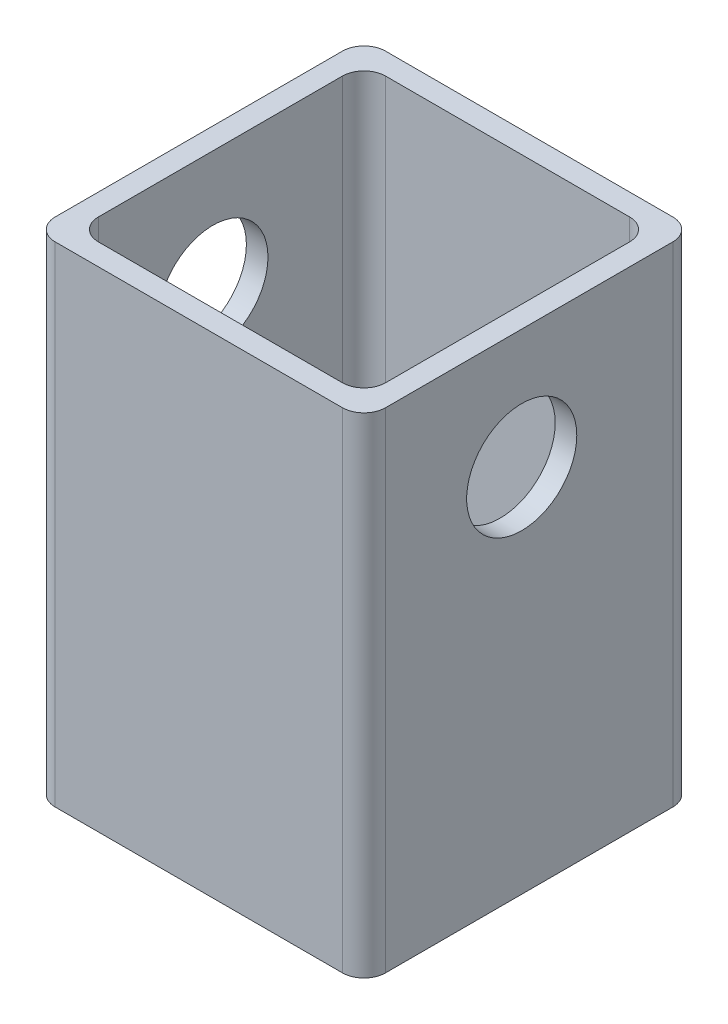
ISO-10303-21;
HEADER;
FILE_DESCRIPTION(('STEP AP214'),'2;1');
FILE_NAME('part.step','',(''),(''),'','','');
FILE_SCHEMA(('AUTOMOTIVE_DESIGN { 1 0 10303 214 1 1 1 1 }'));
ENDSEC;
DATA;
#1=APPLICATION_CONTEXT('core data for automotive mechanical design processes');
#2=APPLICATION_PROTOCOL_DEFINITION('international standard','automotive_design',2000,#1);
#3=PRODUCT_CONTEXT('',#1,'mechanical');
#4=PRODUCT('Part','Part','',(#3));
#5=PRODUCT_RELATED_PRODUCT_CATEGORY('part','',(#4));
#6=PRODUCT_DEFINITION_FORMATION('','',#4);
#7=PRODUCT_DEFINITION_CONTEXT('part definition',#1,'design');
#8=PRODUCT_DEFINITION('design','',#6,#7);
#9=PRODUCT_DEFINITION_SHAPE('','',#8);
#10=(LENGTH_UNIT() NAMED_UNIT(*) SI_UNIT(.MILLI.,.METRE.));
#11=(NAMED_UNIT(*) PLANE_ANGLE_UNIT() SI_UNIT($,.RADIAN.));
#12=(NAMED_UNIT(*) SI_UNIT($,.STERADIAN.) SOLID_ANGLE_UNIT());
#13=UNCERTAINTY_MEASURE_WITH_UNIT(LENGTH_MEASURE(1.E-05),#10,'distance_accuracy_value','');
#14=(GEOMETRIC_REPRESENTATION_CONTEXT(3) GLOBAL_UNCERTAINTY_ASSIGNED_CONTEXT((#13)) GLOBAL_UNIT_ASSIGNED_CONTEXT((#10,
#11,#12)) REPRESENTATION_CONTEXT('',''));
#15=CARTESIAN_POINT('',(0.,0.,0.));
#16=DIRECTION('',(0.,0.,1.));
#17=DIRECTION('',(1.,0.,0.));
#18=AXIS2_PLACEMENT_3D('',#15,#16,#17);
#19=CARTESIAN_POINT('',(7.0358,0.,-7.0358));
#20=DIRECTION('',(0.,1.,0.));
#21=DIRECTION('',(0.,0.,1.));
#22=AXIS2_PLACEMENT_3D('',#19,#20,#21);
#23=CYLINDRICAL_SURFACE('',#22,1.2446);
#24=CARTESIAN_POINT('',(7.0358,28.2217237840637,-7.0358));
#25=DIRECTION('',(0.,-1.,0.));
#26=DIRECTION('',(0.,0.,-1.));
#27=AXIS2_PLACEMENT_3D('',#24,#25,#26);
#28=CIRCLE('',#27,1.2446);
#29=CARTESIAN_POINT('',(7.03579999999999,28.2217237840637,-8.2804));
#30=VERTEX_POINT('',#29);
#31=CARTESIAN_POINT('',(8.2804,28.2217237840637,-7.03579999999999));
#32=VERTEX_POINT('',#31);
#33=EDGE_CURVE('E254',#30,#32,#28,.T.);
#34=ORIENTED_EDGE('',*,*,#33,.F.);
#35=DIRECTION('',(0.,1.,0.));
#36=VECTOR('',#35,1.);
#37=CARTESIAN_POINT('',(7.03579999999999,0.,-8.2804));
#38=LINE('',#37,#36);
#39=CARTESIAN_POINT('',(7.03579999999999,0.,-8.2804));
#40=VERTEX_POINT('',#39);
#41=EDGE_CURVE('E12',#40,#30,#38,.T.);
#42=ORIENTED_EDGE('',*,*,#41,.F.);
#43=CARTESIAN_POINT('',(7.0358,0.,-7.0358));
#44=DIRECTION('',(0.,-1.,0.));
#45=DIRECTION('',(0.,0.,-1.));
#46=AXIS2_PLACEMENT_3D('',#43,#44,#45);
#47=CIRCLE('',#46,1.2446);
#48=CARTESIAN_POINT('',(8.2804,0.,-7.03579999999999));
#49=VERTEX_POINT('',#48);
#50=EDGE_CURVE('E369',#40,#49,#47,.T.);
#51=ORIENTED_EDGE('',*,*,#50,.T.);
#52=DIRECTION('',(0.,1.,0.));
#53=VECTOR('',#52,1.);
#54=CARTESIAN_POINT('',(8.2804,0.,-7.03579999999999));
#55=LINE('',#54,#53);
#56=EDGE_CURVE('E93',#49,#32,#55,.T.);
#57=ORIENTED_EDGE('',*,*,#56,.T.);
#58=EDGE_LOOP('',(#34,#42,#51,#57));
#59=FACE_BOUND('',#58,.T.);
#60=ADVANCED_FACE('F73',(#59),#23,.F.);
#61=CARTESIAN_POINT('',(7.03579999999999,0.,-8.2804));
#62=DIRECTION('',(0.,0.,1.));
#63=DIRECTION('',(1.,0.,0.));
#64=AXIS2_PLACEMENT_3D('',#61,#62,#63);
#65=PLANE('',#64);
#66=DIRECTION('',(1.,0.,0.));
#67=VECTOR('',#66,1.);
#68=CARTESIAN_POINT('',(7.03579999999999,28.2217237840637,-8.2804));
#69=LINE('',#68,#67);
#70=CARTESIAN_POINT('',(-7.03579999999999,28.2217237840637,-8.2804));
#71=VERTEX_POINT('',#70);
#72=EDGE_CURVE('E257',#71,#30,#69,.T.);
#73=ORIENTED_EDGE('',*,*,#72,.F.);
#74=DIRECTION('',(0.,1.,0.));
#75=VECTOR('',#74,1.);
#76=CARTESIAN_POINT('',(-7.03579999999999,0.,-8.2804));
#77=LINE('',#76,#75);
#78=CARTESIAN_POINT('',(-7.03579999999999,0.,-8.2804));
#79=VERTEX_POINT('',#78);
#80=EDGE_CURVE('E84',#79,#71,#77,.T.);
#81=ORIENTED_EDGE('',*,*,#80,.F.);
#82=DIRECTION('',(1.,0.,0.));
#83=VECTOR('',#82,1.);
#84=CARTESIAN_POINT('',(7.03579999999999,0.,-8.2804));
#85=LINE('',#84,#83);
#86=EDGE_CURVE('E372',#79,#40,#85,.T.);
#87=ORIENTED_EDGE('',*,*,#86,.T.);
#88=ORIENTED_EDGE('',*,*,#41,.T.);
#89=EDGE_LOOP('',(#73,#81,#87,#88));
#90=FACE_BOUND('',#89,.T.);
#91=ADVANCED_FACE('F407',(#90),#65,.T.);
#92=CARTESIAN_POINT('',(-7.0358,0.,-7.0358));
#93=DIRECTION('',(0.,1.,0.));
#94=DIRECTION('',(0.,0.,1.));
#95=AXIS2_PLACEMENT_3D('',#92,#93,#94);
#96=CYLINDRICAL_SURFACE('',#95,1.2446);
#97=CARTESIAN_POINT('',(-7.0358,28.2217237840637,-7.0358));
#98=DIRECTION('',(0.,-1.,0.));
#99=DIRECTION('',(0.,0.,-1.));
#100=AXIS2_PLACEMENT_3D('',#97,#98,#99);
#101=CIRCLE('',#100,1.2446);
#102=CARTESIAN_POINT('',(-8.2804,28.2217237840637,-7.03579999999999));
#103=VERTEX_POINT('',#102);
#104=EDGE_CURVE('E261',#103,#71,#101,.T.);
#105=ORIENTED_EDGE('',*,*,#104,.F.);
#106=DIRECTION('',(0.,1.,0.));
#107=VECTOR('',#106,1.);
#108=CARTESIAN_POINT('',(-8.2804,0.,-7.03579999999999));
#109=LINE('',#108,#107);
#110=CARTESIAN_POINT('',(-8.2804,0.,-7.03579999999999));
#111=VERTEX_POINT('',#110);
#112=EDGE_CURVE('E293',#111,#103,#109,.T.);
#113=ORIENTED_EDGE('',*,*,#112,.F.);
#114=CARTESIAN_POINT('',(-7.0358,0.,-7.0358));
#115=DIRECTION('',(0.,-1.,0.));
#116=DIRECTION('',(0.,0.,-1.));
#117=AXIS2_PLACEMENT_3D('',#114,#115,#116);
#118=CIRCLE('',#117,1.2446);
#119=EDGE_CURVE('E376',#111,#79,#118,.T.);
#120=ORIENTED_EDGE('',*,*,#119,.T.);
#121=ORIENTED_EDGE('',*,*,#80,.T.);
#122=EDGE_LOOP('',(#105,#113,#120,#121));
#123=FACE_BOUND('',#122,.T.);
#124=ADVANCED_FACE('F412',(#123),#96,.F.);
#125=CARTESIAN_POINT('',(-8.2804,0.,7.03579999999999));
#126=DIRECTION('',(1.,0.,0.));
#127=DIRECTION('',(0.,0.,-1.));
#128=AXIS2_PLACEMENT_3D('',#125,#126,#127);
#129=PLANE('',#128);
#130=CARTESIAN_POINT('',(-8.2804,21.3316012058941,0.431467727014613));
#131=DIRECTION('',(1.,0.,0.));
#132=DIRECTION('',(0.,0.,-1.));
#133=AXIS2_PLACEMENT_3D('',#130,#131,#132);
#134=CIRCLE('',#133,3.175);
#135=CARTESIAN_POINT('',(-8.2804,21.3316012058941,-2.74353227298539));
#136=VERTEX_POINT('',#135);
#137=EDGE_CURVE('E233',#136,#136,#134,.T.);
#138=ORIENTED_EDGE('',*,*,#137,.F.);
#139=EDGE_LOOP('',(#138));
#140=FACE_BOUND('',#139,.T.);
#141=DIRECTION('',(0.,0.,-1.));
#142=VECTOR('',#141,1.);
#143=CARTESIAN_POINT('',(-8.2804,28.2217237840637,7.03579999999999));
#144=LINE('',#143,#142);
#145=CARTESIAN_POINT('',(-8.2804,28.2217237840637,7.03579999999999));
#146=VERTEX_POINT('',#145);
#147=EDGE_CURVE('E265',#146,#103,#144,.T.);
#148=ORIENTED_EDGE('',*,*,#147,.F.);
#149=DIRECTION('',(0.,1.,0.));
#150=VECTOR('',#149,1.);
#151=CARTESIAN_POINT('',(-8.2804,0.,7.03579999999999));
#152=LINE('',#151,#150);
#153=CARTESIAN_POINT('',(-8.2804,0.,7.03579999999999));
#154=VERTEX_POINT('',#153);
#155=EDGE_CURVE('E290',#154,#146,#152,.T.);
#156=ORIENTED_EDGE('',*,*,#155,.F.);
#157=DIRECTION('',(0.,0.,-1.));
#158=VECTOR('',#157,1.);
#159=CARTESIAN_POINT('',(-8.2804,0.,7.03579999999999));
#160=LINE('',#159,#158);
#161=EDGE_CURVE('E380',#154,#111,#160,.T.);
#162=ORIENTED_EDGE('',*,*,#161,.T.);
#163=ORIENTED_EDGE('',*,*,#112,.T.);
#164=EDGE_LOOP('',(#148,#156,#162,#163));
#165=FACE_BOUND('',#164,.T.);
#166=ADVANCED_FACE('F478',(#140,#165),#129,.T.);
#167=CARTESIAN_POINT('',(-7.0358,0.,7.0358));
#168=DIRECTION('',(0.,1.,0.));
#169=DIRECTION('',(0.,0.,1.));
#170=AXIS2_PLACEMENT_3D('',#167,#168,#169);
#171=CYLINDRICAL_SURFACE('',#170,1.2446);
#172=CARTESIAN_POINT('',(-7.0358,28.2217237840637,7.0358));
#173=DIRECTION('',(0.,-1.,0.));
#174=DIRECTION('',(0.,0.,-1.));
#175=AXIS2_PLACEMENT_3D('',#172,#173,#174);
#176=CIRCLE('',#175,1.2446);
#177=CARTESIAN_POINT('',(-7.03579999999999,28.2217237840637,8.2804));
#178=VERTEX_POINT('',#177);
#179=EDGE_CURVE('E269',#178,#146,#176,.T.);
#180=ORIENTED_EDGE('',*,*,#179,.F.);
#181=DIRECTION('',(0.,1.,0.));
#182=VECTOR('',#181,1.);
#183=CARTESIAN_POINT('',(-7.03579999999999,0.,8.2804));
#184=LINE('',#183,#182);
#185=CARTESIAN_POINT('',(-7.03579999999999,0.,8.2804));
#186=VERTEX_POINT('',#185);
#187=EDGE_CURVE('E205',#186,#178,#184,.T.);
#188=ORIENTED_EDGE('',*,*,#187,.F.);
#189=CARTESIAN_POINT('',(-7.0358,0.,7.0358));
#190=DIRECTION('',(0.,-1.,0.));
#191=DIRECTION('',(0.,0.,-1.));
#192=AXIS2_PLACEMENT_3D('',#189,#190,#191);
#193=CIRCLE('',#192,1.2446);
#194=EDGE_CURVE('E216',#186,#154,#193,.T.);
#195=ORIENTED_EDGE('',*,*,#194,.T.);
#196=ORIENTED_EDGE('',*,*,#155,.T.);
#197=EDGE_LOOP('',(#180,#188,#195,#196));
#198=FACE_BOUND('',#197,.T.);
#199=ADVANCED_FACE('F386',(#198),#171,.F.);
#200=CARTESIAN_POINT('',(7.03579999999999,0.,8.2804));
#201=DIRECTION('',(0.,0.,-1.));
#202=DIRECTION('',(-1.,0.,0.));
#203=AXIS2_PLACEMENT_3D('',#200,#201,#202);
#204=PLANE('',#203);
#205=DIRECTION('',(-1.,0.,0.));
#206=VECTOR('',#205,1.);
#207=CARTESIAN_POINT('',(7.03579999999999,28.2217237840637,8.2804));
#208=LINE('',#207,#206);
#209=CARTESIAN_POINT('',(7.03579999999999,28.2217237840637,8.2804));
#210=VERTEX_POINT('',#209);
#211=EDGE_CURVE('E200',#210,#178,#208,.T.);
#212=ORIENTED_EDGE('',*,*,#211,.F.);
#213=DIRECTION('',(0.,1.,0.));
#214=VECTOR('',#213,1.);
#215=CARTESIAN_POINT('',(7.03579999999999,0.,8.2804));
#216=LINE('',#215,#214);
#217=CARTESIAN_POINT('',(7.03579999999999,0.,8.2804));
#218=VERTEX_POINT('',#217);
#219=EDGE_CURVE('E195',#218,#210,#216,.T.);
#220=ORIENTED_EDGE('',*,*,#219,.F.);
#221=DIRECTION('',(-1.,0.,0.));
#222=VECTOR('',#221,1.);
#223=CARTESIAN_POINT('',(7.03579999999999,0.,8.2804));
#224=LINE('',#223,#222);
#225=EDGE_CURVE('E198',#218,#186,#224,.T.);
#226=ORIENTED_EDGE('',*,*,#225,.T.);
#227=ORIENTED_EDGE('',*,*,#187,.T.);
#228=EDGE_LOOP('',(#212,#220,#226,#227));
#229=FACE_BOUND('',#228,.T.);
#230=ADVANCED_FACE('F197',(#229),#204,.T.);
#231=CARTESIAN_POINT('',(7.0358,0.,7.0358));
#232=DIRECTION('',(0.,1.,0.));
#233=DIRECTION('',(0.,0.,1.));
#234=AXIS2_PLACEMENT_3D('',#231,#232,#233);
#235=CYLINDRICAL_SURFACE('',#234,1.2446);
#236=CARTESIAN_POINT('',(7.0358,28.2217237840637,7.0358));
#237=DIRECTION('',(0.,-1.,0.));
#238=DIRECTION('',(0.,0.,1.));
#239=AXIS2_PLACEMENT_3D('',#236,#237,#238);
#240=CIRCLE('',#239,1.2446);
#241=CARTESIAN_POINT('',(8.2804,28.2217237840637,7.03579999999999));
#242=VERTEX_POINT('',#241);
#243=EDGE_CURVE('E275',#242,#210,#240,.T.);
#244=ORIENTED_EDGE('',*,*,#243,.F.);
#245=DIRECTION('',(0.,1.,0.));
#246=VECTOR('',#245,1.);
#247=CARTESIAN_POINT('',(8.2804,0.,7.03579999999999));
#248=LINE('',#247,#246);
#249=CARTESIAN_POINT('',(8.2804,0.,7.03579999999999));
#250=VERTEX_POINT('',#249);
#251=EDGE_CURVE('E142',#250,#242,#248,.T.);
#252=ORIENTED_EDGE('',*,*,#251,.F.);
#253=CARTESIAN_POINT('',(7.0358,0.,7.0358));
#254=DIRECTION('',(0.,-1.,0.));
#255=DIRECTION('',(0.,0.,1.));
#256=AXIS2_PLACEMENT_3D('',#253,#254,#255);
#257=CIRCLE('',#256,1.2446);
#258=EDGE_CURVE('E213',#250,#218,#257,.T.);
#259=ORIENTED_EDGE('',*,*,#258,.T.);
#260=ORIENTED_EDGE('',*,*,#219,.T.);
#261=EDGE_LOOP('',(#244,#252,#259,#260));
#262=FACE_BOUND('',#261,.T.);
#263=ADVANCED_FACE('F219',(#262),#235,.F.);
#264=CARTESIAN_POINT('',(8.2804,0.,-8.2804));
#265=DIRECTION('',(0.,1.,0.));
#266=DIRECTION('',(0.,0.,1.));
#267=AXIS2_PLACEMENT_3D('',#264,#265,#266);
#268=CYLINDRICAL_SURFACE('',#267,1.2446);
#269=CARTESIAN_POINT('',(8.2804,28.2217237840637,-8.2804));
#270=DIRECTION('',(0.,-1.,0.));
#271=DIRECTION('',(0.,0.,1.));
#272=AXIS2_PLACEMENT_3D('',#269,#270,#271);
#273=CIRCLE('',#272,1.2446);
#274=CARTESIAN_POINT('',(8.28039999999999,28.2217237840637,-9.525));
#275=VERTEX_POINT('',#274);
#276=CARTESIAN_POINT('',(9.525,28.2217237840637,-8.28039999999999));
#277=VERTEX_POINT('',#276);
#278=EDGE_CURVE('E228',#275,#277,#273,.T.);
#279=ORIENTED_EDGE('',*,*,#278,.T.);
#280=DIRECTION('',(0.,1.,0.));
#281=VECTOR('',#280,1.);
#282=CARTESIAN_POINT('',(9.525,0.,-8.28039999999999));
#283=LINE('',#282,#281);
#284=CARTESIAN_POINT('',(9.525,0.,-8.28039999999999));
#285=VERTEX_POINT('',#284);
#286=EDGE_CURVE('E285',#285,#277,#283,.T.);
#287=ORIENTED_EDGE('',*,*,#286,.F.);
#288=CARTESIAN_POINT('',(8.2804,0.,-8.2804));
#289=DIRECTION('',(0.,-1.,0.));
#290=DIRECTION('',(0.,0.,1.));
#291=AXIS2_PLACEMENT_3D('',#288,#289,#290);
#292=CIRCLE('',#291,1.2446);
#293=CARTESIAN_POINT('',(8.28039999999999,0.,-9.525));
#294=VERTEX_POINT('',#293);
#295=EDGE_CURVE('E282',#294,#285,#292,.T.);
#296=ORIENTED_EDGE('',*,*,#295,.F.);
#297=DIRECTION('',(0.,1.,0.));
#298=VECTOR('',#297,1.);
#299=CARTESIAN_POINT('',(8.28039999999999,0.,-9.525));
#300=LINE('',#299,#298);
#301=EDGE_CURVE('E224',#294,#275,#300,.T.);
#302=ORIENTED_EDGE('',*,*,#301,.T.);
#303=EDGE_LOOP('',(#279,#287,#296,#302));
#304=FACE_BOUND('',#303,.T.);
#305=ADVANCED_FACE('F75',(#304),#268,.T.);
#306=CARTESIAN_POINT('',(9.525,0.,8.28039999999999));
#307=DIRECTION('',(-1.,0.,0.));
#308=DIRECTION('',(0.,0.,1.));
#309=AXIS2_PLACEMENT_3D('',#306,#307,#308);
#310=PLANE('',#309);
#311=CARTESIAN_POINT('',(9.525,21.3316012058941,0.431467727014613));
#312=DIRECTION('',(1.,0.,0.));
#313=DIRECTION('',(0.,0.,-1.));
#314=AXIS2_PLACEMENT_3D('',#311,#312,#313);
#315=CIRCLE('',#314,3.175);
#316=CARTESIAN_POINT('',(9.525,21.3316012058941,-2.74353227298539));
#317=VERTEX_POINT('',#316);
#318=EDGE_CURVE('E438',#317,#317,#315,.T.);
#319=ORIENTED_EDGE('',*,*,#318,.F.);
#320=EDGE_LOOP('',(#319));
#321=FACE_BOUND('',#320,.T.);
#322=DIRECTION('',(0.,0.,1.));
#323=VECTOR('',#322,1.);
#324=CARTESIAN_POINT('',(9.525,28.2217237840637,8.28039999999999));
#325=LINE('',#324,#323);
#326=CARTESIAN_POINT('',(9.525,28.2217237840637,8.28039999999999));
#327=VERTEX_POINT('',#326);
#328=EDGE_CURVE('E232',#277,#327,#325,.T.);
#329=ORIENTED_EDGE('',*,*,#328,.T.);
#330=DIRECTION('',(0.,1.,0.));
#331=VECTOR('',#330,1.);
#332=CARTESIAN_POINT('',(9.525,0.,8.28039999999999));
#333=LINE('',#332,#331);
#334=CARTESIAN_POINT('',(9.525,0.,8.28039999999999));
#335=VERTEX_POINT('',#334);
#336=EDGE_CURVE('E321',#335,#327,#333,.T.);
#337=ORIENTED_EDGE('',*,*,#336,.F.);
#338=DIRECTION('',(0.,0.,1.));
#339=VECTOR('',#338,1.);
#340=CARTESIAN_POINT('',(9.525,0.,8.28039999999999));
#341=LINE('',#340,#339);
#342=EDGE_CURVE('E155',#285,#335,#341,.T.);
#343=ORIENTED_EDGE('',*,*,#342,.F.);
#344=ORIENTED_EDGE('',*,*,#286,.T.);
#345=EDGE_LOOP('',(#329,#337,#343,#344));
#346=FACE_BOUND('',#345,.T.);
#347=ADVANCED_FACE('F326',(#321,#346),#310,.F.);
#348=CARTESIAN_POINT('',(8.2804,0.,8.2804));
#349=DIRECTION('',(0.,1.,0.));
#350=DIRECTION('',(0.,0.,1.));
#351=AXIS2_PLACEMENT_3D('',#348,#349,#350);
#352=CYLINDRICAL_SURFACE('',#351,1.2446);
#353=CARTESIAN_POINT('',(8.2804,28.2217237840637,8.2804));
#354=DIRECTION('',(0.,-1.,0.));
#355=DIRECTION('',(0.,0.,-1.));
#356=AXIS2_PLACEMENT_3D('',#353,#354,#355);
#357=CIRCLE('',#356,1.2446);
#358=CARTESIAN_POINT('',(8.28039999999999,28.2217237840637,9.525));
#359=VERTEX_POINT('',#358);
#360=EDGE_CURVE('E236',#327,#359,#357,.T.);
#361=ORIENTED_EDGE('',*,*,#360,.T.);
#362=DIRECTION('',(0.,1.,0.));
#363=VECTOR('',#362,1.);
#364=CARTESIAN_POINT('',(8.28039999999999,0.,9.525));
#365=LINE('',#364,#363);
#366=CARTESIAN_POINT('',(8.28039999999999,0.,9.525));
#367=VERTEX_POINT('',#366);
#368=EDGE_CURVE('E317',#367,#359,#365,.T.);
#369=ORIENTED_EDGE('',*,*,#368,.F.);
#370=CARTESIAN_POINT('',(8.2804,0.,8.2804));
#371=DIRECTION('',(0.,-1.,0.));
#372=DIRECTION('',(0.,0.,-1.));
#373=AXIS2_PLACEMENT_3D('',#370,#371,#372);
#374=CIRCLE('',#373,1.2446);
#375=EDGE_CURVE('E352',#335,#367,#374,.T.);
#376=ORIENTED_EDGE('',*,*,#375,.F.);
#377=ORIENTED_EDGE('',*,*,#336,.T.);
#378=EDGE_LOOP('',(#361,#369,#376,#377));
#379=FACE_BOUND('',#378,.T.);
#380=ADVANCED_FACE('F341',(#379),#352,.T.);
#381=CARTESIAN_POINT('',(8.28039999999999,0.,9.525));
#382=DIRECTION('',(0.,0.,-1.));
#383=DIRECTION('',(-1.,0.,0.));
#384=AXIS2_PLACEMENT_3D('',#381,#382,#383);
#385=PLANE('',#384);
#386=DIRECTION('',(-1.,0.,0.));
#387=VECTOR('',#386,1.);
#388=CARTESIAN_POINT('',(8.28039999999999,28.2217237840637,9.525));
#389=LINE('',#388,#387);
#390=CARTESIAN_POINT('',(-8.28039999999999,28.2217237840637,9.525));
#391=VERTEX_POINT('',#390);
#392=EDGE_CURVE('E239',#359,#391,#389,.T.);
#393=ORIENTED_EDGE('',*,*,#392,.T.);
#394=DIRECTION('',(0.,1.,0.));
#395=VECTOR('',#394,1.);
#396=CARTESIAN_POINT('',(-8.28039999999999,0.,9.525));
#397=LINE('',#396,#395);
#398=CARTESIAN_POINT('',(-8.28039999999999,0.,9.525));
#399=VERTEX_POINT('',#398);
#400=EDGE_CURVE('E313',#399,#391,#397,.T.);
#401=ORIENTED_EDGE('',*,*,#400,.F.);
#402=DIRECTION('',(-1.,0.,0.));
#403=VECTOR('',#402,1.);
#404=CARTESIAN_POINT('',(8.28039999999999,0.,9.525));
#405=LINE('',#404,#403);
#406=EDGE_CURVE('E347',#367,#399,#405,.T.);
#407=ORIENTED_EDGE('',*,*,#406,.F.);
#408=ORIENTED_EDGE('',*,*,#368,.T.);
#409=EDGE_LOOP('',(#393,#401,#407,#408));
#410=FACE_BOUND('',#409,.T.);
#411=ADVANCED_FACE('F345',(#410),#385,.F.);
#412=CARTESIAN_POINT('',(-8.2804,0.,8.2804));
#413=DIRECTION('',(0.,1.,0.));
#414=DIRECTION('',(0.,0.,1.));
#415=AXIS2_PLACEMENT_3D('',#412,#413,#414);
#416=CYLINDRICAL_SURFACE('',#415,1.2446);
#417=CARTESIAN_POINT('',(-8.2804,28.2217237840637,8.2804));
#418=DIRECTION('',(0.,-1.,0.));
#419=DIRECTION('',(0.,0.,-1.));
#420=AXIS2_PLACEMENT_3D('',#417,#418,#419);
#421=CIRCLE('',#420,1.2446);
#422=CARTESIAN_POINT('',(-9.525,28.2217237840637,8.28039999999999));
#423=VERTEX_POINT('',#422);
#424=EDGE_CURVE('E242',#391,#423,#421,.T.);
#425=ORIENTED_EDGE('',*,*,#424,.T.);
#426=DIRECTION('',(0.,1.,0.));
#427=VECTOR('',#426,1.);
#428=CARTESIAN_POINT('',(-9.525,0.,8.28039999999999));
#429=LINE('',#428,#427);
#430=CARTESIAN_POINT('',(-9.525,0.,8.28039999999999));
#431=VERTEX_POINT('',#430);
#432=EDGE_CURVE('E309',#431,#423,#429,.T.);
#433=ORIENTED_EDGE('',*,*,#432,.F.);
#434=CARTESIAN_POINT('',(-8.2804,0.,8.2804));
#435=DIRECTION('',(0.,-1.,0.));
#436=DIRECTION('',(0.,0.,-1.));
#437=AXIS2_PLACEMENT_3D('',#434,#435,#436);
#438=CIRCLE('',#437,1.2446);
#439=EDGE_CURVE('E351',#399,#431,#438,.T.);
#440=ORIENTED_EDGE('',*,*,#439,.F.);
#441=ORIENTED_EDGE('',*,*,#400,.T.);
#442=EDGE_LOOP('',(#425,#433,#440,#441));
#443=FACE_BOUND('',#442,.T.);
#444=ADVANCED_FACE('F422',(#443),#416,.T.);
#445=CARTESIAN_POINT('',(-9.525,0.,8.28039999999999));
#446=DIRECTION('',(1.,0.,0.));
#447=DIRECTION('',(0.,0.,-1.));
#448=AXIS2_PLACEMENT_3D('',#445,#446,#447);
#449=PLANE('',#448);
#450=CARTESIAN_POINT('',(-9.525,21.3316012058941,0.431467727014613));
#451=DIRECTION('',(1.,0.,0.));
#452=DIRECTION('',(0.,0.,-1.));
#453=AXIS2_PLACEMENT_3D('',#450,#451,#452);
#454=CIRCLE('',#453,3.175);
#455=CARTESIAN_POINT('',(-9.525,21.3316012058941,-2.74353227298539));
#456=VERTEX_POINT('',#455);
#457=EDGE_CURVE('E441',#456,#456,#454,.T.);
#458=ORIENTED_EDGE('',*,*,#457,.T.);
#459=EDGE_LOOP('',(#458));
#460=FACE_BOUND('',#459,.T.);
#461=DIRECTION('',(0.,0.,-1.));
#462=VECTOR('',#461,1.);
#463=CARTESIAN_POINT('',(-9.525,28.2217237840637,8.28039999999999));
#464=LINE('',#463,#462);
#465=CARTESIAN_POINT('',(-9.525,28.2217237840637,-8.28039999999999));
#466=VERTEX_POINT('',#465);
#467=EDGE_CURVE('E245',#423,#466,#464,.T.);
#468=ORIENTED_EDGE('',*,*,#467,.T.);
#469=DIRECTION('',(0.,1.,0.));
#470=VECTOR('',#469,1.);
#471=CARTESIAN_POINT('',(-9.525,0.,-8.28039999999999));
#472=LINE('',#471,#470);
#473=CARTESIAN_POINT('',(-9.525,0.,-8.28039999999999));
#474=VERTEX_POINT('',#473);
#475=EDGE_CURVE('E305',#474,#466,#472,.T.);
#476=ORIENTED_EDGE('',*,*,#475,.F.);
#477=DIRECTION('',(0.,0.,-1.));
#478=VECTOR('',#477,1.);
#479=CARTESIAN_POINT('',(-9.525,0.,8.28039999999999));
#480=LINE('',#479,#478);
#481=EDGE_CURVE('E356',#431,#474,#480,.T.);
#482=ORIENTED_EDGE('',*,*,#481,.F.);
#483=ORIENTED_EDGE('',*,*,#432,.T.);
#484=EDGE_LOOP('',(#468,#476,#482,#483));
#485=FACE_BOUND('',#484,.T.);
#486=ADVANCED_FACE('F419',(#460,#485),#449,.F.);
#487=CARTESIAN_POINT('',(-8.2804,0.,-8.2804));
#488=DIRECTION('',(0.,1.,0.));
#489=DIRECTION('',(0.,0.,1.));
#490=AXIS2_PLACEMENT_3D('',#487,#488,#489);
#491=CYLINDRICAL_SURFACE('',#490,1.2446);
#492=CARTESIAN_POINT('',(-8.2804,28.2217237840637,-8.2804));
#493=DIRECTION('',(0.,-1.,0.));
#494=DIRECTION('',(0.,0.,-1.));
#495=AXIS2_PLACEMENT_3D('',#492,#493,#494);
#496=CIRCLE('',#495,1.2446);
#497=CARTESIAN_POINT('',(-8.2804,28.2217237840637,-9.525));
#498=VERTEX_POINT('',#497);
#499=EDGE_CURVE('E248',#466,#498,#496,.T.);
#500=ORIENTED_EDGE('',*,*,#499,.T.);
#501=DIRECTION('',(0.,1.,0.));
#502=VECTOR('',#501,1.);
#503=CARTESIAN_POINT('',(-8.2804,0.,-9.525));
#504=LINE('',#503,#502);
#505=CARTESIAN_POINT('',(-8.2804,0.,-9.525));
#506=VERTEX_POINT('',#505);
#507=EDGE_CURVE('E301',#506,#498,#504,.T.);
#508=ORIENTED_EDGE('',*,*,#507,.F.);
#509=CARTESIAN_POINT('',(-8.2804,0.,-8.2804));
#510=DIRECTION('',(0.,-1.,0.));
#511=DIRECTION('',(0.,0.,-1.));
#512=AXIS2_PLACEMENT_3D('',#509,#510,#511);
#513=CIRCLE('',#512,1.2446);
#514=EDGE_CURVE('E363',#474,#506,#513,.T.);
#515=ORIENTED_EDGE('',*,*,#514,.F.);
#516=ORIENTED_EDGE('',*,*,#475,.T.);
#517=EDGE_LOOP('',(#500,#508,#515,#516));
#518=FACE_BOUND('',#517,.T.);
#519=ADVANCED_FACE('F400',(#518),#491,.T.);
#520=CARTESIAN_POINT('',(8.28039999999999,0.,-9.525));
#521=DIRECTION('',(0.,0.,1.));
#522=DIRECTION('',(1.,0.,0.));
#523=AXIS2_PLACEMENT_3D('',#520,#521,#522);
#524=PLANE('',#523);
#525=DIRECTION('',(1.,0.,0.));
#526=VECTOR('',#525,1.);
#527=CARTESIAN_POINT('',(8.28039999999999,28.2217237840637,-9.525));
#528=LINE('',#527,#526);
#529=EDGE_CURVE('E251',#498,#275,#528,.T.);
#530=ORIENTED_EDGE('',*,*,#529,.T.);
#531=ORIENTED_EDGE('',*,*,#301,.F.);
#532=DIRECTION('',(1.,0.,0.));
#533=VECTOR('',#532,1.);
#534=CARTESIAN_POINT('',(8.28039999999999,0.,-9.525));
#535=LINE('',#534,#533);
#536=EDGE_CURVE('E366',#506,#294,#535,.T.);
#537=ORIENTED_EDGE('',*,*,#536,.F.);
#538=ORIENTED_EDGE('',*,*,#507,.T.);
#539=EDGE_LOOP('',(#530,#531,#537,#538));
#540=FACE_BOUND('',#539,.T.);
#541=ADVANCED_FACE('F390',(#540),#524,.F.);
#542=CARTESIAN_POINT('',(8.2804,0.,7.03579999999999));
#543=DIRECTION('',(-1.,0.,0.));
#544=DIRECTION('',(0.,0.,1.));
#545=AXIS2_PLACEMENT_3D('',#542,#543,#544);
#546=PLANE('',#545);
#547=CARTESIAN_POINT('',(8.2804,21.3316012058941,0.431467727014613));
#548=DIRECTION('',(-1.,0.,0.));
#549=DIRECTION('',(0.,0.,1.));
#550=AXIS2_PLACEMENT_3D('',#547,#548,#549);
#551=CIRCLE('',#550,3.175);
#552=CARTESIAN_POINT('',(8.2804,21.3316012058941,-2.74353227298539));
#553=VERTEX_POINT('',#552);
#554=EDGE_CURVE('E77',#553,#553,#551,.T.);
#555=ORIENTED_EDGE('',*,*,#554,.F.);
#556=EDGE_LOOP('',(#555));
#557=FACE_BOUND('',#556,.T.);
#558=DIRECTION('',(0.,0.,1.));
#559=VECTOR('',#558,1.);
#560=CARTESIAN_POINT('',(8.2804,28.2217237840637,7.03579999999999));
#561=LINE('',#560,#559);
#562=EDGE_CURVE('E278',#32,#242,#561,.T.);
#563=ORIENTED_EDGE('',*,*,#562,.F.);
#564=ORIENTED_EDGE('',*,*,#56,.F.);
#565=DIRECTION('',(0.,0.,1.));
#566=VECTOR('',#565,1.);
#567=CARTESIAN_POINT('',(8.2804,0.,7.03579999999999));
#568=LINE('',#567,#566);
#569=EDGE_CURVE('E221',#49,#250,#568,.T.);
#570=ORIENTED_EDGE('',*,*,#569,.T.);
#571=ORIENTED_EDGE('',*,*,#251,.T.);
#572=EDGE_LOOP('',(#563,#564,#570,#571));
#573=FACE_BOUND('',#572,.T.);
#574=ADVANCED_FACE('F388',(#557,#573),#546,.T.);
#575=CARTESIAN_POINT('',(8.2804,0.,-8.2804));
#576=DIRECTION('',(0.,1.,0.));
#577=DIRECTION('',(0.,0.,1.));
#578=AXIS2_PLACEMENT_3D('',#575,#576,#577);
#579=PLANE('',#578);
#580=ORIENTED_EDGE('',*,*,#295,.T.);
#581=ORIENTED_EDGE('',*,*,#342,.T.);
#582=ORIENTED_EDGE('',*,*,#375,.T.);
#583=ORIENTED_EDGE('',*,*,#406,.T.);
#584=ORIENTED_EDGE('',*,*,#439,.T.);
#585=ORIENTED_EDGE('',*,*,#481,.T.);
#586=ORIENTED_EDGE('',*,*,#514,.T.);
#587=ORIENTED_EDGE('',*,*,#536,.T.);
#588=EDGE_LOOP('',(#580,#581,#582,#583,#584,#585,#586,#587));
#589=FACE_BOUND('',#588,.T.);
#590=ORIENTED_EDGE('',*,*,#50,.F.);
#591=ORIENTED_EDGE('',*,*,#86,.F.);
#592=ORIENTED_EDGE('',*,*,#119,.F.);
#593=ORIENTED_EDGE('',*,*,#161,.F.);
#594=ORIENTED_EDGE('',*,*,#194,.F.);
#595=ORIENTED_EDGE('',*,*,#225,.F.);
#596=ORIENTED_EDGE('',*,*,#258,.F.);
#597=ORIENTED_EDGE('',*,*,#569,.F.);
#598=EDGE_LOOP('',(#590,#591,#592,#593,#594,#595,#596,#597));
#599=FACE_BOUND('',#598,.T.);
#600=ADVANCED_FACE('F211',(#589,#599),#579,.F.);
#601=CARTESIAN_POINT('',(8.2804,28.2217237840637,-8.2804));
#602=DIRECTION('',(0.,1.,0.));
#603=DIRECTION('',(0.,0.,1.));
#604=AXIS2_PLACEMENT_3D('',#601,#602,#603);
#605=PLANE('',#604);
#606=ORIENTED_EDGE('',*,*,#278,.F.);
#607=ORIENTED_EDGE('',*,*,#529,.F.);
#608=ORIENTED_EDGE('',*,*,#499,.F.);
#609=ORIENTED_EDGE('',*,*,#467,.F.);
#610=ORIENTED_EDGE('',*,*,#424,.F.);
#611=ORIENTED_EDGE('',*,*,#392,.F.);
#612=ORIENTED_EDGE('',*,*,#360,.F.);
#613=ORIENTED_EDGE('',*,*,#328,.F.);
#614=EDGE_LOOP('',(#606,#607,#608,#609,#610,#611,#612,#613));
#615=FACE_BOUND('',#614,.T.);
#616=ORIENTED_EDGE('',*,*,#33,.T.);
#617=ORIENTED_EDGE('',*,*,#562,.T.);
#618=ORIENTED_EDGE('',*,*,#243,.T.);
#619=ORIENTED_EDGE('',*,*,#211,.T.);
#620=ORIENTED_EDGE('',*,*,#179,.T.);
#621=ORIENTED_EDGE('',*,*,#147,.T.);
#622=ORIENTED_EDGE('',*,*,#104,.T.);
#623=ORIENTED_EDGE('',*,*,#72,.T.);
#624=EDGE_LOOP('',(#616,#617,#618,#619,#620,#621,#622,#623));
#625=FACE_BOUND('',#624,.T.);
#626=ADVANCED_FACE('F333',(#615,#625),#605,.T.);
#627=CARTESIAN_POINT('',(-9.525,21.3316012058941,0.431467727014613));
#628=DIRECTION('',(1.,0.,0.));
#629=DIRECTION('',(0.,0.,-1.));
#630=AXIS2_PLACEMENT_3D('',#627,#628,#629);
#631=CYLINDRICAL_SURFACE('',#630,3.175);
#632=CARTESIAN_POINT('',(8.2804,21.3316012058941,-2.74353227298539));
#633=CARTESIAN_POINT('',(8.29336458333334,21.3316012058941,-2.74353227298539));
#634=CARTESIAN_POINT('',(8.30632916666667,21.3316012058941,-2.74353227298539));
#635=CARTESIAN_POINT('',(8.33225833333334,21.3316012058941,-2.74353227298539));
#636=CARTESIAN_POINT('',(8.34522291666667,21.3316012058941,-2.74353227298539));
#637=CARTESIAN_POINT('',(8.37115208333334,21.3316012058941,-2.74353227298539));
#638=CARTESIAN_POINT('',(8.38411666666667,21.3316012058941,-2.74353227298539));
#639=CARTESIAN_POINT('',(8.41004583333333,21.3316012058941,-2.74353227298539));
#640=CARTESIAN_POINT('',(8.42301041666667,21.3316012058941,-2.74353227298539));
#641=CARTESIAN_POINT('',(8.44893958333333,21.3316012058941,-2.74353227298539));
#642=CARTESIAN_POINT('',(8.46190416666667,21.3316012058941,-2.74353227298539));
#643=CARTESIAN_POINT('',(8.48783333333333,21.3316012058941,-2.74353227298539));
#644=CARTESIAN_POINT('',(8.50079791666667,21.3316012058941,-2.74353227298539));
#645=CARTESIAN_POINT('',(8.52672708333333,21.3316012058941,-2.74353227298539));
#646=CARTESIAN_POINT('',(8.53969166666667,21.3316012058941,-2.74353227298539));
#647=CARTESIAN_POINT('',(8.56562083333333,21.3316012058941,-2.74353227298539));
#648=CARTESIAN_POINT('',(8.57858541666667,21.3316012058941,-2.74353227298539));
#649=CARTESIAN_POINT('',(8.60451458333334,21.3316012058941,-2.74353227298539));
#650=CARTESIAN_POINT('',(8.61747916666667,21.3316012058941,-2.74353227298539));
#651=CARTESIAN_POINT('',(8.64340833333334,21.3316012058941,-2.74353227298539));
#652=CARTESIAN_POINT('',(8.65637291666667,21.3316012058941,-2.74353227298539));
#653=CARTESIAN_POINT('',(8.68230208333333,21.3316012058941,-2.74353227298539));
#654=CARTESIAN_POINT('',(8.69526666666667,21.3316012058941,-2.74353227298539));
#655=CARTESIAN_POINT('',(8.72119583333334,21.3316012058941,-2.74353227298539));
#656=CARTESIAN_POINT('',(8.73416041666667,21.3316012058941,-2.74353227298539));
#657=CARTESIAN_POINT('',(8.76008958333333,21.3316012058941,-2.74353227298539));
#658=CARTESIAN_POINT('',(8.77305416666667,21.3316012058941,-2.74353227298539));
#659=CARTESIAN_POINT('',(8.79898333333333,21.3316012058941,-2.74353227298539));
#660=CARTESIAN_POINT('',(8.81194791666667,21.3316012058941,-2.74353227298539));
#661=CARTESIAN_POINT('',(8.83787708333333,21.3316012058941,-2.74353227298539));
#662=CARTESIAN_POINT('',(8.85084166666667,21.3316012058941,-2.74353227298539));
#663=CARTESIAN_POINT('',(8.87677083333333,21.3316012058941,-2.74353227298539));
#664=CARTESIAN_POINT('',(8.88973541666667,21.3316012058941,-2.74353227298539));
#665=CARTESIAN_POINT('',(8.91566458333334,21.3316012058941,-2.74353227298539));
#666=CARTESIAN_POINT('',(8.92862916666667,21.3316012058941,-2.74353227298539));
#667=CARTESIAN_POINT('',(8.95455833333333,21.3316012058941,-2.74353227298539));
#668=CARTESIAN_POINT('',(8.96752291666667,21.3316012058941,-2.74353227298539));
#669=CARTESIAN_POINT('',(8.99345208333333,21.3316012058941,-2.74353227298539));
#670=CARTESIAN_POINT('',(9.00641666666667,21.3316012058941,-2.74353227298539));
#671=CARTESIAN_POINT('',(9.03234583333333,21.3316012058941,-2.74353227298539));
#672=CARTESIAN_POINT('',(9.04531041666667,21.3316012058941,-2.74353227298539));
#673=CARTESIAN_POINT('',(9.07123958333333,21.3316012058941,-2.74353227298539));
#674=CARTESIAN_POINT('',(9.08420416666667,21.3316012058941,-2.74353227298539));
#675=CARTESIAN_POINT('',(9.11013333333333,21.3316012058941,-2.74353227298539));
#676=CARTESIAN_POINT('',(9.12309791666667,21.3316012058941,-2.74353227298539));
#677=CARTESIAN_POINT('',(9.14902708333333,21.3316012058941,-2.74353227298539));
#678=CARTESIAN_POINT('',(9.16199166666667,21.3316012058941,-2.74353227298539));
#679=CARTESIAN_POINT('',(9.18792083333333,21.3316012058941,-2.74353227298539));
#680=CARTESIAN_POINT('',(9.20088541666667,21.3316012058941,-2.74353227298539));
#681=CARTESIAN_POINT('',(9.22681458333333,21.3316012058941,-2.74353227298539));
#682=CARTESIAN_POINT('',(9.23977916666667,21.3316012058941,-2.74353227298539));
#683=CARTESIAN_POINT('',(9.26570833333333,21.3316012058941,-2.74353227298539));
#684=CARTESIAN_POINT('',(9.27867291666667,21.3316012058941,-2.74353227298539));
#685=CARTESIAN_POINT('',(9.30460208333333,21.3316012058941,-2.74353227298539));
#686=CARTESIAN_POINT('',(9.31756666666667,21.3316012058941,-2.74353227298539));
#687=CARTESIAN_POINT('',(9.34349583333334,21.3316012058941,-2.74353227298539));
#688=CARTESIAN_POINT('',(9.35646041666667,21.3316012058941,-2.74353227298539));
#689=CARTESIAN_POINT('',(9.38238958333334,21.3316012058941,-2.74353227298539));
#690=CARTESIAN_POINT('',(9.39535416666667,21.3316012058941,-2.74353227298539));
#691=CARTESIAN_POINT('',(9.42128333333333,21.3316012058941,-2.74353227298539));
#692=CARTESIAN_POINT('',(9.43424791666667,21.3316012058941,-2.74353227298539));
#693=CARTESIAN_POINT('',(9.46017708333333,21.3316012058941,-2.74353227298539));
#694=CARTESIAN_POINT('',(9.47314166666667,21.3316012058941,-2.74353227298539));
#695=CARTESIAN_POINT('',(9.49907083333333,21.3316012058941,-2.74353227298539));
#696=CARTESIAN_POINT('',(9.51203541666667,21.3316012058941,-2.74353227298539));
#697=CARTESIAN_POINT('',(9.525,21.3316012058941,-2.74353227298539));
#698=B_SPLINE_CURVE_WITH_KNOTS('',3,(#632,#633,#634,#635,#636,#637,#638,#639,#640,#641,#642,
#643,#644,#645,#646,#647,#648,#649,#650,#651,#652,#653,#654,#655,#656,#657,#658,#659,#660,#661,
#662,#663,#664,#665,#666,#667,#668,#669,#670,#671,#672,#673,#674,#675,#676,#677,#678,#679,#680,
#681,#682,#683,#684,#685,#686,#687,#688,#689,#690,#691,#692,#693,#694,#695,#696,#697),
.UNSPECIFIED.,.F.,.F.,(4,2,2,2,2,2,2,2,2,2,2,2,2,2,2,2,2,2,2,2,2,2,2,2,2,2,2,2,2,2,2,2,4),(0.,
0.0388937500000013,0.077787499999999,0.11668125,0.155574999999998,0.194468749999999,
0.233362500000001,0.272256249999998,0.31115,0.350043750000001,0.388937499999999,0.42783125,
0.466725000000001,0.505618749999999,0.5445125,0.583406249999998,0.622299999999999,0.66119375,
0.700087499999998,0.738981249999999,0.777874999999997,0.816768749999999,0.8556625,
0.894556249999998,0.933449999999999,0.97234375,1.0112375,1.05013125,1.089025,1.12791875,
1.1668125,1.20570625,1.2446),.UNSPECIFIED.);
#699=EDGE_CURVE('BSEAM463',#553,#317,#698,.T.);
#700=ORIENTED_EDGE('',*,*,#554,.T.);
#701=ORIENTED_EDGE('',*,*,#318,.T.);
#702=ORIENTED_EDGE('',*,*,#699,.T.);
#703=ORIENTED_EDGE('',*,*,#699,.F.);
#704=EDGE_LOOP('',(#700,#702,#701,#703));
#705=FACE_BOUND('',#704,.T.);
#706=ADVANCED_FACE('F463',(#705),#631,.F.);
#707=CARTESIAN_POINT('',(-8.2804,21.3316012058941,-2.74353227298539));
#708=CARTESIAN_POINT('',(-8.29336458333333,21.3316012058941,-2.74353227298539));
#709=CARTESIAN_POINT('',(-8.30632916666667,21.3316012058941,-2.74353227298539));
#710=CARTESIAN_POINT('',(-8.33225833333333,21.3316012058941,-2.74353227298539));
#711=CARTESIAN_POINT('',(-8.34522291666667,21.3316012058941,-2.74353227298539));
#712=CARTESIAN_POINT('',(-8.37115208333333,21.3316012058941,-2.74353227298539));
#713=CARTESIAN_POINT('',(-8.38411666666667,21.3316012058941,-2.74353227298539));
#714=CARTESIAN_POINT('',(-8.41004583333333,21.3316012058941,-2.74353227298539));
#715=CARTESIAN_POINT('',(-8.42301041666667,21.3316012058941,-2.74353227298539));
#716=CARTESIAN_POINT('',(-8.44893958333333,21.3316012058941,-2.74353227298539));
#717=CARTESIAN_POINT('',(-8.46190416666667,21.3316012058941,-2.74353227298539));
#718=CARTESIAN_POINT('',(-8.48783333333333,21.3316012058941,-2.74353227298539));
#719=CARTESIAN_POINT('',(-8.50079791666666,21.3316012058941,-2.74353227298539));
#720=CARTESIAN_POINT('',(-8.52672708333333,21.3316012058941,-2.74353227298539));
#721=CARTESIAN_POINT('',(-8.53969166666667,21.3316012058941,-2.74353227298539));
#722=CARTESIAN_POINT('',(-8.56562083333333,21.3316012058941,-2.74353227298539));
#723=CARTESIAN_POINT('',(-8.57858541666667,21.3316012058941,-2.74353227298539));
#724=CARTESIAN_POINT('',(-8.60451458333333,21.3316012058941,-2.74353227298539));
#725=CARTESIAN_POINT('',(-8.61747916666667,21.3316012058941,-2.74353227298539));
#726=CARTESIAN_POINT('',(-8.64340833333333,21.3316012058941,-2.74353227298539));
#727=CARTESIAN_POINT('',(-8.65637291666667,21.3316012058941,-2.74353227298539));
#728=CARTESIAN_POINT('',(-8.68230208333333,21.3316012058941,-2.74353227298539));
#729=CARTESIAN_POINT('',(-8.69526666666667,21.3316012058941,-2.74353227298539));
#730=CARTESIAN_POINT('',(-8.72119583333333,21.3316012058941,-2.74353227298539));
#731=CARTESIAN_POINT('',(-8.73416041666667,21.3316012058941,-2.74353227298539));
#732=CARTESIAN_POINT('',(-8.76008958333333,21.3316012058941,-2.74353227298539));
#733=CARTESIAN_POINT('',(-8.77305416666666,21.3316012058941,-2.74353227298539));
#734=CARTESIAN_POINT('',(-8.79898333333333,21.3316012058941,-2.74353227298539));
#735=CARTESIAN_POINT('',(-8.81194791666667,21.3316012058941,-2.74353227298539));
#736=CARTESIAN_POINT('',(-8.83787708333333,21.3316012058941,-2.74353227298539));
#737=CARTESIAN_POINT('',(-8.85084166666667,21.3316012058941,-2.74353227298539));
#738=CARTESIAN_POINT('',(-8.87677083333333,21.3316012058941,-2.74353227298539));
#739=CARTESIAN_POINT('',(-8.88973541666667,21.3316012058941,-2.74353227298539));
#740=CARTESIAN_POINT('',(-8.91566458333333,21.3316012058941,-2.74353227298539));
#741=CARTESIAN_POINT('',(-8.92862916666667,21.3316012058941,-2.74353227298539));
#742=CARTESIAN_POINT('',(-8.95455833333333,21.3316012058941,-2.74353227298539));
#743=CARTESIAN_POINT('',(-8.96752291666667,21.3316012058941,-2.74353227298539));
#744=CARTESIAN_POINT('',(-8.99345208333333,21.3316012058941,-2.74353227298539));
#745=CARTESIAN_POINT('',(-9.00641666666667,21.3316012058941,-2.74353227298539));
#746=CARTESIAN_POINT('',(-9.03234583333333,21.3316012058941,-2.74353227298539));
#747=CARTESIAN_POINT('',(-9.04531041666667,21.3316012058941,-2.74353227298539));
#748=CARTESIAN_POINT('',(-9.07123958333333,21.3316012058941,-2.74353227298539));
#749=CARTESIAN_POINT('',(-9.08420416666667,21.3316012058941,-2.74353227298539));
#750=CARTESIAN_POINT('',(-9.11013333333333,21.3316012058941,-2.74353227298539));
#751=CARTESIAN_POINT('',(-9.12309791666667,21.3316012058941,-2.74353227298539));
#752=CARTESIAN_POINT('',(-9.14902708333333,21.3316012058941,-2.74353227298539));
#753=CARTESIAN_POINT('',(-9.16199166666667,21.3316012058941,-2.74353227298539));
#754=CARTESIAN_POINT('',(-9.18792083333333,21.3316012058941,-2.74353227298539));
#755=CARTESIAN_POINT('',(-9.20088541666667,21.3316012058941,-2.74353227298539));
#756=CARTESIAN_POINT('',(-9.22681458333333,21.3316012058941,-2.74353227298539));
#757=CARTESIAN_POINT('',(-9.23977916666667,21.3316012058941,-2.74353227298539));
#758=CARTESIAN_POINT('',(-9.26570833333333,21.3316012058941,-2.74353227298539));
#759=CARTESIAN_POINT('',(-9.27867291666667,21.3316012058941,-2.74353227298539));
#760=CARTESIAN_POINT('',(-9.30460208333334,21.3316012058941,-2.74353227298539));
#761=CARTESIAN_POINT('',(-9.31756666666667,21.3316012058941,-2.74353227298539));
#762=CARTESIAN_POINT('',(-9.34349583333334,21.3316012058941,-2.74353227298539));
#763=CARTESIAN_POINT('',(-9.35646041666667,21.3316012058941,-2.74353227298539));
#764=CARTESIAN_POINT('',(-9.38238958333334,21.3316012058941,-2.74353227298539));
#765=CARTESIAN_POINT('',(-9.39535416666667,21.3316012058941,-2.74353227298539));
#766=CARTESIAN_POINT('',(-9.42128333333334,21.3316012058941,-2.74353227298539));
#767=CARTESIAN_POINT('',(-9.43424791666667,21.3316012058941,-2.74353227298539));
#768=CARTESIAN_POINT('',(-9.46017708333333,21.3316012058941,-2.74353227298539));
#769=CARTESIAN_POINT('',(-9.47314166666667,21.3316012058941,-2.74353227298539));
#770=CARTESIAN_POINT('',(-9.49907083333333,21.3316012058941,-2.74353227298539));
#771=CARTESIAN_POINT('',(-9.51203541666667,21.3316012058941,-2.74353227298539));
#772=CARTESIAN_POINT('',(-9.525,21.3316012058941,-2.74353227298539));
#773=B_SPLINE_CURVE_WITH_KNOTS('',3,(#707,#708,#709,#710,#711,#712,#713,#714,#715,#716,#717,
#718,#719,#720,#721,#722,#723,#724,#725,#726,#727,#728,#729,#730,#731,#732,#733,#734,#735,#736,
#737,#738,#739,#740,#741,#742,#743,#744,#745,#746,#747,#748,#749,#750,#751,#752,#753,#754,#755,
#756,#757,#758,#759,#760,#761,#762,#763,#764,#765,#766,#767,#768,#769,#770,#771,#772),
.UNSPECIFIED.,.F.,.F.,(4,2,2,2,2,2,2,2,2,2,2,2,2,2,2,2,2,2,2,2,2,2,2,2,2,2,2,2,2,2,2,2,4),(0.,
0.0388937500000013,0.0777875000000008,0.11668125,0.155575000000002,0.194468750000001,
0.233362500000001,0.272256250000002,0.311150000000001,0.350043750000001,0.3889375,
0.427831250000002,0.466725000000001,0.505618750000001,0.544512500000002,0.583406250000001,
0.622300000000001,0.661193750000002,0.700087500000002,0.738981250000001,0.777875000000003,
0.816768750000002,0.855662500000002,0.894556250000003,0.933450000000002,0.972343750000002,
1.0112375,1.05013125,1.089025,1.12791875,1.1668125,1.20570625,1.2446),.UNSPECIFIED.);
#774=EDGE_CURVE('BSEAM464',#136,#456,#773,.T.);
#775=ORIENTED_EDGE('',*,*,#137,.T.);
#776=ORIENTED_EDGE('',*,*,#457,.F.);
#777=ORIENTED_EDGE('',*,*,#774,.T.);
#778=ORIENTED_EDGE('',*,*,#774,.F.);
#779=EDGE_LOOP('',(#775,#777,#776,#778));
#780=FACE_BOUND('',#779,.T.);
#781=ADVANCED_FACE('F464',(#780),#631,.F.);
#782=CLOSED_SHELL('',(#60,#91,#124,#166,#199,#230,#263,#305,#347,#380,#411,#444,#486,#519,#541,
#574,#600,#626,#706,#781));
#783=MANIFOLD_SOLID_BREP('B2',#782);
#784=ADVANCED_BREP_SHAPE_REPRESENTATION('',(#18,#783),#14);
#785=SHAPE_DEFINITION_REPRESENTATION(#9,#784);
ENDSEC;
END-ISO-10303-21;
